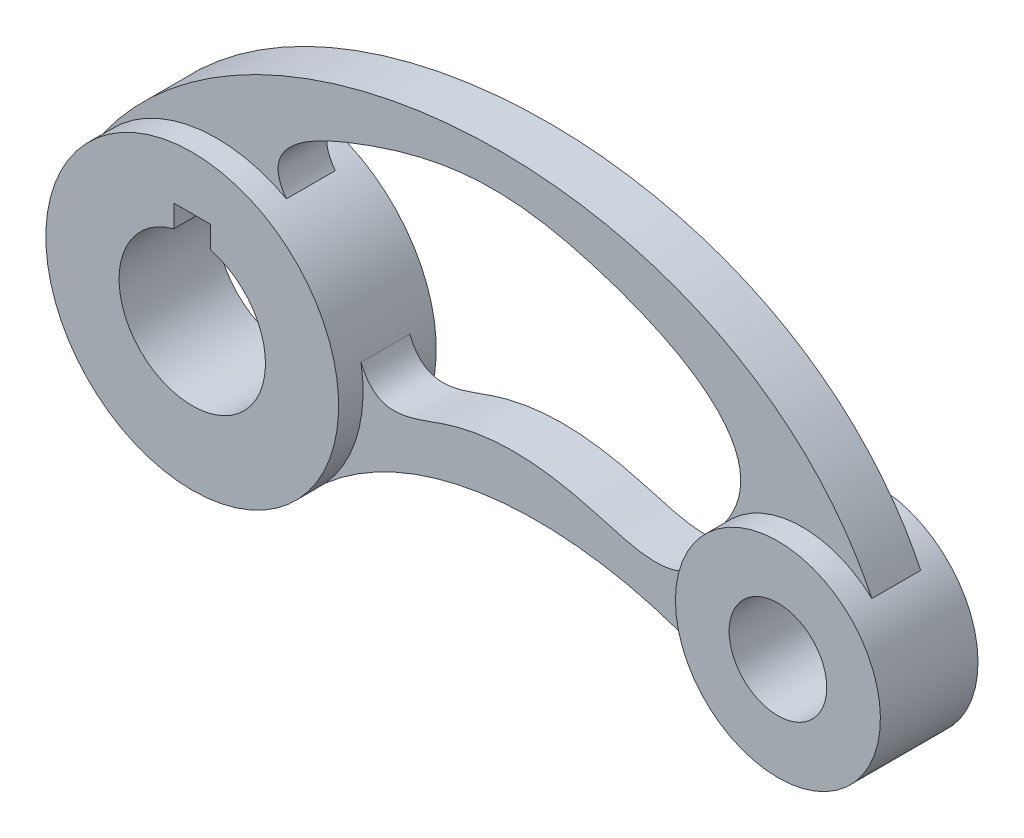
ISO-10303-21;
HEADER;
FILE_DESCRIPTION(('STEP AP214'),'2;1');
FILE_NAME('part.step','',(''),(''),'','','');
FILE_SCHEMA(('AUTOMOTIVE_DESIGN { 1 0 10303 214 1 1 1 1 }'));
ENDSEC;
DATA;
#1=APPLICATION_CONTEXT('core data for automotive mechanical design processes');
#2=APPLICATION_PROTOCOL_DEFINITION('international standard','automotive_design',2000,#1);
#3=PRODUCT_CONTEXT('',#1,'mechanical');
#4=PRODUCT('Part','Part','',(#3));
#5=PRODUCT_RELATED_PRODUCT_CATEGORY('part','',(#4));
#6=PRODUCT_DEFINITION_FORMATION('','',#4);
#7=PRODUCT_DEFINITION_CONTEXT('part definition',#1,'design');
#8=PRODUCT_DEFINITION('design','',#6,#7);
#9=PRODUCT_DEFINITION_SHAPE('','',#8);
#10=(LENGTH_UNIT() NAMED_UNIT(*) SI_UNIT(.MILLI.,.METRE.));
#11=(NAMED_UNIT(*) PLANE_ANGLE_UNIT() SI_UNIT($,.RADIAN.));
#12=(NAMED_UNIT(*) SI_UNIT($,.STERADIAN.) SOLID_ANGLE_UNIT());
#13=UNCERTAINTY_MEASURE_WITH_UNIT(LENGTH_MEASURE(1.E-05),#10,'distance_accuracy_value','');
#14=(GEOMETRIC_REPRESENTATION_CONTEXT(3) GLOBAL_UNCERTAINTY_ASSIGNED_CONTEXT((#13)) GLOBAL_UNIT_ASSIGNED_CONTEXT((#10,
#11,#12)) REPRESENTATION_CONTEXT('',''));
#15=CARTESIAN_POINT('',(0.,0.,0.));
#16=DIRECTION('',(0.,0.,1.));
#17=DIRECTION('',(1.,0.,0.));
#18=AXIS2_PLACEMENT_3D('',#15,#16,#17);
#19=CARTESIAN_POINT('',(-91.6861836239554,0.192134417452549,-10.));
#20=DIRECTION('',(0.,0.,1.));
#21=DIRECTION('',(1.,0.,0.));
#22=AXIS2_PLACEMENT_3D('',#19,#20,#21);
#23=CYLINDRICAL_SURFACE('',#22,30.);
#24=DIRECTION('',(0.,0.,1.));
#25=VECTOR('',#24,1.);
#26=CARTESIAN_POINT('',(-117.149088001357,16.0553150779416,-10.));
#27=LINE('',#26,#25);
#28=CARTESIAN_POINT('',(-117.149088001357,16.0553150779416,-10.));
#29=VERTEX_POINT('',#28);
#30=CARTESIAN_POINT('',(-117.149088001357,16.0553150779416,-5.));
#31=VERTEX_POINT('',#30);
#32=EDGE_CURVE('E338',#29,#31,#27,.T.);
#33=ORIENTED_EDGE('',*,*,#32,.T.);
#34=CARTESIAN_POINT('',(-91.6861836239554,0.192134417452549,-5.));
#35=DIRECTION('',(0.,0.,1.));
#36=DIRECTION('',(1.,0.,0.));
#37=AXIS2_PLACEMENT_3D('',#34,#35,#36);
#38=CIRCLE('',#37,30.);
#39=CARTESIAN_POINT('',(-77.3865652534526,26.5648649256495,-5.));
#40=VERTEX_POINT('',#39);
#41=EDGE_CURVE('E254',#40,#31,#38,.T.);
#42=ORIENTED_EDGE('',*,*,#41,.F.);
#43=DIRECTION('',(0.,0.,1.));
#44=VECTOR('',#43,1.);
#45=CARTESIAN_POINT('',(-77.3865652534526,26.5648649256495,-5.));
#46=LINE('',#45,#44);
#47=CARTESIAN_POINT('',(-77.3865652534526,26.5648649256495,5.));
#48=VERTEX_POINT('',#47);
#49=EDGE_CURVE('E266',#40,#48,#46,.T.);
#50=ORIENTED_EDGE('',*,*,#49,.T.);
#51=CARTESIAN_POINT('',(-91.6861836239554,0.192134417452549,5.));
#52=DIRECTION('',(0.,0.,1.));
#53=DIRECTION('',(1.,0.,0.));
#54=AXIS2_PLACEMENT_3D('',#51,#52,#53);
#55=CIRCLE('',#54,30.);
#56=CARTESIAN_POINT('',(-117.149088001357,16.0553150779416,5.));
#57=VERTEX_POINT('',#56);
#58=EDGE_CURVE('E524',#48,#57,#55,.T.);
#59=ORIENTED_EDGE('',*,*,#58,.T.);
#60=CARTESIAN_POINT('',(-117.149088001357,16.0553150779416,10.));
#61=VERTEX_POINT('',#60);
#62=EDGE_CURVE('E340',#57,#61,#27,.T.);
#63=ORIENTED_EDGE('',*,*,#62,.T.);
#64=CARTESIAN_POINT('',(-91.6861836239554,0.192134417452549,10.));
#65=DIRECTION('',(0.,0.,1.));
#66=DIRECTION('',(1.,0.,0.));
#67=AXIS2_PLACEMENT_3D('',#64,#65,#66);
#68=CIRCLE('',#67,30.);
#69=CARTESIAN_POINT('',(-117.209659143342,15.9576727023089,10.));
#70=VERTEX_POINT('',#69);
#71=EDGE_CURVE('E282',#70,#61,#68,.T.);
#72=ORIENTED_EDGE('',*,*,#71,.F.);
#73=DIRECTION('',(0.,0.,1.));
#74=VECTOR('',#73,1.);
#75=CARTESIAN_POINT('',(-117.209659143342,15.9576727023089,-10.));
#76=LINE('',#75,#74);
#77=CARTESIAN_POINT('',(-117.209659143342,15.9576727023089,-10.));
#78=VERTEX_POINT('',#77);
#79=EDGE_CURVE('E52',#78,#70,#76,.T.);
#80=ORIENTED_EDGE('',*,*,#79,.F.);
#81=CARTESIAN_POINT('',(-91.6861836239554,0.192134417452549,-10.));
#82=DIRECTION('',(0.,0.,1.));
#83=DIRECTION('',(1.,0.,0.));
#84=AXIS2_PLACEMENT_3D('',#81,#82,#83);
#85=CIRCLE('',#84,30.);
#86=EDGE_CURVE('E310',#78,#29,#85,.T.);
#87=ORIENTED_EDGE('',*,*,#86,.T.);
#88=EDGE_LOOP('',(#33,#42,#50,#59,#63,#72,#80,#87));
#89=FACE_BOUND('',#88,.T.);
#90=DIRECTION('',(0.,0.,1.));
#91=VECTOR('',#90,1.);
#92=CARTESIAN_POINT('',(-62.1049143779897,5.18698274324613,-5.));
#93=LINE('',#92,#91);
#94=CARTESIAN_POINT('',(-62.1049143779896,5.18698274324613,-5.));
#95=VERTEX_POINT('',#94);
#96=CARTESIAN_POINT('',(-62.1049143779897,5.18698274324613,5.));
#97=VERTEX_POINT('',#96);
#98=EDGE_CURVE('E66',#95,#97,#93,.T.);
#99=ORIENTED_EDGE('',*,*,#98,.F.);
#100=CARTESIAN_POINT('',(-91.6861836239554,0.192134417452549,-5.));
#101=DIRECTION('',(0.,0.,1.));
#102=DIRECTION('',(1.,0.,0.));
#103=AXIS2_PLACEMENT_3D('',#100,#101,#102);
#104=CIRCLE('',#103,30.);
#105=CARTESIAN_POINT('',(-69.3616146887647,-19.8481655268577,-5.));
#106=VERTEX_POINT('',#105);
#107=EDGE_CURVE('E70',#106,#95,#104,.T.);
#108=ORIENTED_EDGE('',*,*,#107,.F.);
#109=DIRECTION('',(0.,0.,1.));
#110=VECTOR('',#109,1.);
#111=CARTESIAN_POINT('',(-69.3616146887647,-19.8481655268577,-5.));
#112=LINE('',#111,#110);
#113=CARTESIAN_POINT('',(-69.3616146887647,-19.8481655268577,5.));
#114=VERTEX_POINT('',#113);
#115=EDGE_CURVE('E158',#106,#114,#112,.T.);
#116=ORIENTED_EDGE('',*,*,#115,.T.);
#117=CARTESIAN_POINT('',(-91.6861836239554,0.192134417452549,5.));
#118=DIRECTION('',(0.,0.,1.));
#119=DIRECTION('',(1.,0.,0.));
#120=AXIS2_PLACEMENT_3D('',#117,#118,#119);
#121=CIRCLE('',#120,30.);
#122=EDGE_CURVE('E161',#114,#97,#121,.T.);
#123=ORIENTED_EDGE('',*,*,#122,.T.);
#124=EDGE_LOOP('',(#99,#108,#116,#123));
#125=FACE_BOUND('',#124,.T.);
#126=ADVANCED_FACE('F47',(#89,#125),#23,.T.);
#127=CARTESIAN_POINT('',(28.3138163760446,0.192134417452549,-10.));
#128=DIRECTION('',(0.,0.,1.));
#129=DIRECTION('',(1.,0.,0.));
#130=AXIS2_PLACEMENT_3D('',#127,#128,#129);
#131=CYLINDRICAL_SURFACE('',#130,21.);
#132=CARTESIAN_POINT('',(28.3138163760446,0.192134417452549,-5.));
#133=DIRECTION('',(0.,0.,1.));
#134=DIRECTION('',(1.,0.,0.));
#135=AXIS2_PLACEMENT_3D('',#132,#133,#134);
#136=CIRCLE('',#135,21.);
#137=CARTESIAN_POINT('',(42.5666227122662,15.6147642691401,-5.));
#138=VERTEX_POINT('',#137);
#139=CARTESIAN_POINT('',(12.1963912193826,13.6542518704908,-5.));
#140=VERTEX_POINT('',#139);
#141=EDGE_CURVE('E253',#138,#140,#136,.T.);
#142=ORIENTED_EDGE('',*,*,#141,.F.);
#143=DIRECTION('',(0.,0.,1.));
#144=VECTOR('',#143,1.);
#145=CARTESIAN_POINT('',(42.5666227122662,15.6147642691401,-5.));
#146=LINE('',#145,#144);
#147=CARTESIAN_POINT('',(42.5666227122662,15.6147642691401,5.));
#148=VERTEX_POINT('',#147);
#149=EDGE_CURVE('E267',#138,#148,#146,.T.);
#150=ORIENTED_EDGE('',*,*,#149,.T.);
#151=CARTESIAN_POINT('',(28.3138163760446,0.192134417452549,5.));
#152=DIRECTION('',(0.,0.,1.));
#153=DIRECTION('',(1.,0.,0.));
#154=AXIS2_PLACEMENT_3D('',#151,#152,#153);
#155=CIRCLE('',#154,21.);
#156=CARTESIAN_POINT('',(12.1963912193826,13.6542518704908,5.));
#157=VERTEX_POINT('',#156);
#158=EDGE_CURVE('E536',#148,#157,#155,.T.);
#159=ORIENTED_EDGE('',*,*,#158,.T.);
#160=DIRECTION('',(0.,0.,1.));
#161=VECTOR('',#160,1.);
#162=CARTESIAN_POINT('',(12.1963912193826,13.6542518704908,-10.));
#163=LINE('',#162,#161);
#164=CARTESIAN_POINT('',(12.1963912193826,13.6542518704908,10.));
#165=VERTEX_POINT('',#164);
#166=EDGE_CURVE('E517',#157,#165,#163,.T.);
#167=ORIENTED_EDGE('',*,*,#166,.T.);
#168=CARTESIAN_POINT('',(28.3138163760446,0.192134417452549,10.));
#169=DIRECTION('',(0.,0.,1.));
#170=DIRECTION('',(1.,0.,0.));
#171=AXIS2_PLACEMENT_3D('',#168,#169,#170);
#172=CIRCLE('',#171,21.);
#173=CARTESIAN_POINT('',(11.1123390152125,12.2382614550019,10.));
#174=VERTEX_POINT('',#173);
#175=EDGE_CURVE('E484',#174,#165,#172,.T.);
#176=ORIENTED_EDGE('',*,*,#175,.F.);
#177=DIRECTION('',(0.,0.,1.));
#178=VECTOR('',#177,1.);
#179=CARTESIAN_POINT('',(11.1123390152125,12.2382614550019,-10.));
#180=LINE('',#179,#178);
#181=CARTESIAN_POINT('',(11.1123390152125,12.2382614550019,-10.));
#182=VERTEX_POINT('',#181);
#183=EDGE_CURVE('E518',#182,#174,#180,.T.);
#184=ORIENTED_EDGE('',*,*,#183,.F.);
#185=CARTESIAN_POINT('',(28.3138163760446,0.192134417452549,-10.));
#186=DIRECTION('',(0.,0.,1.));
#187=DIRECTION('',(1.,0.,0.));
#188=AXIS2_PLACEMENT_3D('',#185,#186,#187);
#189=CIRCLE('',#188,21.);
#190=CARTESIAN_POINT('',(12.1963912193826,13.6542518704908,-10.));
#191=VERTEX_POINT('',#190);
#192=EDGE_CURVE('E507',#182,#191,#189,.T.);
#193=ORIENTED_EDGE('',*,*,#192,.T.);
#194=EDGE_CURVE('E525',#191,#140,#163,.T.);
#195=ORIENTED_EDGE('',*,*,#194,.T.);
#196=EDGE_LOOP('',(#142,#150,#159,#167,#176,#184,#193,#195));
#197=FACE_BOUND('',#196,.T.);
#198=DIRECTION('',(0.,0.,1.));
#199=VECTOR('',#198,1.);
#200=CARTESIAN_POINT('',(13.0490035363857,-14.2295675961859,-5.));
#201=LINE('',#200,#199);
#202=CARTESIAN_POINT('',(13.0490035363857,-14.2295675961859,-5.));
#203=VERTEX_POINT('',#202);
#204=CARTESIAN_POINT('',(13.0490035363857,-14.2295675961859,5.));
#205=VERTEX_POINT('',#204);
#206=EDGE_CURVE('E166',#203,#205,#201,.T.);
#207=ORIENTED_EDGE('',*,*,#206,.F.);
#208=CARTESIAN_POINT('',(28.3138163760446,0.192134417452549,-5.));
#209=DIRECTION('',(0.,0.,1.));
#210=DIRECTION('',(1.,0.,0.));
#211=AXIS2_PLACEMENT_3D('',#208,#209,#210);
#212=CIRCLE('',#211,21.);
#213=CARTESIAN_POINT('',(7.66747778521394,4.02993362960206,-5.));
#214=VERTEX_POINT('',#213);
#215=EDGE_CURVE('E475',#214,#203,#212,.T.);
#216=ORIENTED_EDGE('',*,*,#215,.F.);
#217=DIRECTION('',(0.,0.,1.));
#218=VECTOR('',#217,1.);
#219=CARTESIAN_POINT('',(7.66747778521396,4.02993362960205,-5.));
#220=LINE('',#219,#218);
#221=CARTESIAN_POINT('',(7.66747778521396,4.02993362960205,5.));
#222=VERTEX_POINT('',#221);
#223=EDGE_CURVE('E476',#214,#222,#220,.T.);
#224=ORIENTED_EDGE('',*,*,#223,.T.);
#225=CARTESIAN_POINT('',(28.3138163760446,0.192134417452549,5.));
#226=DIRECTION('',(0.,0.,1.));
#227=DIRECTION('',(1.,0.,0.));
#228=AXIS2_PLACEMENT_3D('',#225,#226,#227);
#229=CIRCLE('',#228,21.);
#230=EDGE_CURVE('E175',#222,#205,#229,.T.);
#231=ORIENTED_EDGE('',*,*,#230,.T.);
#232=EDGE_LOOP('',(#207,#216,#224,#231));
#233=FACE_BOUND('',#232,.T.);
#234=ADVANCED_FACE('F222',(#197,#233),#131,.T.);
#235=CARTESIAN_POINT('',(-91.6861836239554,0.192134417452549,-10.));
#236=DIRECTION('',(0.,0.,1.));
#237=DIRECTION('',(1.,0.,0.));
#238=AXIS2_PLACEMENT_3D('',#235,#236,#237);
#239=CYLINDRICAL_SURFACE('',#238,15.);
#240=DIRECTION('',(0.,0.,1.));
#241=VECTOR('',#240,1.);
#242=CARTESIAN_POINT('',(-95.4725947076119,14.7063719484275,-10.));
#243=LINE('',#242,#241);
#244=CARTESIAN_POINT('',(-95.4725947076119,14.7063719484275,-10.));
#245=VERTEX_POINT('',#244);
#246=CARTESIAN_POINT('',(-95.4725947076119,14.7063719484275,10.));
#247=VERTEX_POINT('',#246);
#248=EDGE_CURVE('E336',#245,#247,#243,.T.);
#249=ORIENTED_EDGE('',*,*,#248,.T.);
#250=CARTESIAN_POINT('',(-91.6861836239554,0.192134417452549,10.));
#251=DIRECTION('',(0.,0.,1.));
#252=DIRECTION('',(1.,0.,0.));
#253=AXIS2_PLACEMENT_3D('',#250,#251,#252);
#254=CIRCLE('',#253,15.);
#255=CARTESIAN_POINT('',(-87.8997725402989,14.7063719484275,10.));
#256=VERTEX_POINT('',#255);
#257=EDGE_CURVE('E289',#247,#256,#254,.T.);
#258=ORIENTED_EDGE('',*,*,#257,.T.);
#259=DIRECTION('',(0.,0.,1.));
#260=VECTOR('',#259,1.);
#261=CARTESIAN_POINT('',(-87.8997725402989,14.7063719484275,-10.));
#262=LINE('',#261,#260);
#263=CARTESIAN_POINT('',(-87.8997725402989,14.7063719484275,-10.));
#264=VERTEX_POINT('',#263);
#265=EDGE_CURVE('E11',#264,#256,#262,.T.);
#266=ORIENTED_EDGE('',*,*,#265,.F.);
#267=CARTESIAN_POINT('',(-91.6861836239554,0.192134417452549,-10.));
#268=DIRECTION('',(0.,0.,1.));
#269=DIRECTION('',(1.,0.,0.));
#270=AXIS2_PLACEMENT_3D('',#267,#268,#269);
#271=CIRCLE('',#270,15.);
#272=EDGE_CURVE('E317',#245,#264,#271,.T.);
#273=ORIENTED_EDGE('',*,*,#272,.F.);
#274=EDGE_LOOP('',(#249,#258,#266,#273));
#275=FACE_BOUND('',#274,.T.);
#276=ADVANCED_FACE('F225',(#275),#239,.F.);
#277=CARTESIAN_POINT('',(-87.8997725403002,8.27533506242133E-12,-10.));
#278=DIRECTION('',(1.,0.,0.));
#279=DIRECTION('',(0.,1.,0.));
#280=AXIS2_PLACEMENT_3D('',#277,#278,#279);
#281=PLANE('',#280);
#282=ORIENTED_EDGE('',*,*,#265,.T.);
#283=DIRECTION('',(0.,1.,0.));
#284=VECTOR('',#283,1.);
#285=CARTESIAN_POINT('',(-87.8997725403002,8.27533506242133E-12,10.));
#286=LINE('',#285,#284);
#287=CARTESIAN_POINT('',(-87.8997725402984,19.2760341864527,10.));
#288=VERTEX_POINT('',#287);
#289=EDGE_CURVE('E301',#256,#288,#286,.T.);
#290=ORIENTED_EDGE('',*,*,#289,.T.);
#291=DIRECTION('',(0.,0.,1.));
#292=VECTOR('',#291,1.);
#293=CARTESIAN_POINT('',(-87.8997725402984,19.2760341864527,-10.));
#294=LINE('',#293,#292);
#295=CARTESIAN_POINT('',(-87.8997725402984,19.2760341864527,-10.));
#296=VERTEX_POINT('',#295);
#297=EDGE_CURVE('E58',#296,#288,#294,.T.);
#298=ORIENTED_EDGE('',*,*,#297,.F.);
#299=DIRECTION('',(0.,1.,0.));
#300=VECTOR('',#299,1.);
#301=CARTESIAN_POINT('',(-87.8997725403002,8.27533506242133E-12,-10.));
#302=LINE('',#301,#300);
#303=EDGE_CURVE('E328',#264,#296,#302,.T.);
#304=ORIENTED_EDGE('',*,*,#303,.F.);
#305=EDGE_LOOP('',(#282,#290,#298,#304));
#306=FACE_BOUND('',#305,.T.);
#307=ADVANCED_FACE('F372',(#306),#281,.F.);
#308=CARTESIAN_POINT('',(2.11949024793215E-13,19.2760341864518,-10.));
#309=DIRECTION('',(0.,1.,0.));
#310=DIRECTION('',(-1.,0.,0.));
#311=AXIS2_PLACEMENT_3D('',#308,#309,#310);
#312=PLANE('',#311);
#313=ORIENTED_EDGE('',*,*,#297,.T.);
#314=DIRECTION('',(-1.,0.,0.));
#315=VECTOR('',#314,1.);
#316=CARTESIAN_POINT('',(2.11949024793215E-13,19.2760341864518,10.));
#317=LINE('',#316,#315);
#318=CARTESIAN_POINT('',(-95.4725947076119,19.2760341864528,10.));
#319=VERTEX_POINT('',#318);
#320=EDGE_CURVE('E297',#288,#319,#317,.T.);
#321=ORIENTED_EDGE('',*,*,#320,.T.);
#322=DIRECTION('',(0.,0.,1.));
#323=VECTOR('',#322,1.);
#324=CARTESIAN_POINT('',(-95.4725947076119,19.2760341864528,-10.));
#325=LINE('',#324,#323);
#326=CARTESIAN_POINT('',(-95.4725947076119,19.2760341864528,-10.));
#327=VERTEX_POINT('',#326);
#328=EDGE_CURVE('E333',#327,#319,#325,.T.);
#329=ORIENTED_EDGE('',*,*,#328,.F.);
#330=DIRECTION('',(-1.,0.,0.));
#331=VECTOR('',#330,1.);
#332=CARTESIAN_POINT('',(2.11949024793215E-13,19.2760341864518,-10.));
#333=LINE('',#332,#331);
#334=EDGE_CURVE('E325',#296,#327,#333,.T.);
#335=ORIENTED_EDGE('',*,*,#334,.F.);
#336=EDGE_LOOP('',(#313,#321,#329,#335));
#337=FACE_BOUND('',#336,.T.);
#338=ADVANCED_FACE('F369',(#337),#312,.F.);
#339=CARTESIAN_POINT('',(-117.209659143342,15.9576727023089,-10.));
#340=CARTESIAN_POINT('',(-84.6753540802233,68.5009184786909,-10.));
#341=CARTESIAN_POINT('',(15.0574098943898,72.7650791319882,-10.));
#342=CARTESIAN_POINT('',(42.5666227122662,15.6147642691401,-10.));
#343=B_SPLINE_CURVE_WITH_KNOTS('',3,(#339,#340,#341,#342),.UNSPECIFIED.,.F.,.F.,(4,4),(0.,1.),.UNSPECIFIED.);
#344=DIRECTION('',(0.,0.,1.));
#345=VECTOR('',#344,1.);
#346=SURFACE_OF_LINEAR_EXTRUSION('',#343,#345);
#347=ORIENTED_EDGE('',*,*,#79,.T.);
#348=CARTESIAN_POINT('',(-117.209659143342,15.9576727023089,10.));
#349=CARTESIAN_POINT('',(-84.6753540802233,68.5009184786909,10.));
#350=CARTESIAN_POINT('',(15.0574098943898,72.7650791319882,10.));
#351=CARTESIAN_POINT('',(42.5666227122662,15.6147642691401,10.));
#352=B_SPLINE_CURVE_WITH_KNOTS('',3,(#348,#349,#350,#351),.UNSPECIFIED.,.F.,.F.,(4,4),(0.,1.),.UNSPECIFIED.);
#353=EDGE_CURVE('E274',#70,#61,#352,.T.);
#354=ORIENTED_EDGE('',*,*,#353,.T.);
#355=ORIENTED_EDGE('',*,*,#62,.F.);
#356=CARTESIAN_POINT('',(-117.209659143342,15.9576727023089,5.));
#357=CARTESIAN_POINT('',(-84.6753540802233,68.5009184786909,5.));
#358=CARTESIAN_POINT('',(15.0574098943898,72.7650791319882,5.));
#359=CARTESIAN_POINT('',(42.5666227122662,15.6147642691401,5.));
#360=B_SPLINE_CURVE_WITH_KNOTS('',3,(#356,#357,#358,#359),.UNSPECIFIED.,.F.,.F.,(4,4),(0.,1.),.UNSPECIFIED.);
#361=EDGE_CURVE('E542',#57,#148,#360,.T.);
#362=ORIENTED_EDGE('',*,*,#361,.T.);
#363=ORIENTED_EDGE('',*,*,#149,.F.);
#364=CARTESIAN_POINT('',(-117.209659143342,15.9576727023089,-5.));
#365=CARTESIAN_POINT('',(-84.6753540802233,68.5009184786909,-5.));
#366=CARTESIAN_POINT('',(15.0574098943898,72.7650791319882,-5.));
#367=CARTESIAN_POINT('',(42.5666227122662,15.6147642691401,-5.));
#368=B_SPLINE_CURVE_WITH_KNOTS('',3,(#364,#365,#366,#367),.UNSPECIFIED.,.F.,.F.,(4,4),(0.,1.),.UNSPECIFIED.);
#369=EDGE_CURVE('E261',#31,#138,#368,.T.);
#370=ORIENTED_EDGE('',*,*,#369,.F.);
#371=ORIENTED_EDGE('',*,*,#32,.F.);
#372=EDGE_CURVE('E304',#78,#29,#343,.T.);
#373=ORIENTED_EDGE('',*,*,#372,.F.);
#374=EDGE_LOOP('',(#347,#354,#355,#362,#363,#370,#371,#373));
#375=FACE_BOUND('',#374,.T.);
#376=ADVANCED_FACE('F49',(#375),#346,.F.);
#377=CARTESIAN_POINT('',(-95.4725947076119,0.,-10.));
#378=DIRECTION('',(1.,0.,0.));
#379=DIRECTION('',(0.,0.,-1.));
#380=AXIS2_PLACEMENT_3D('',#377,#378,#379);
#381=PLANE('',#380);
#382=ORIENTED_EDGE('',*,*,#328,.T.);
#383=DIRECTION('',(0.,1.,0.));
#384=VECTOR('',#383,1.);
#385=CARTESIAN_POINT('',(-95.4725947076119,0.,10.));
#386=LINE('',#385,#384);
#387=EDGE_CURVE('E293',#247,#319,#386,.T.);
#388=ORIENTED_EDGE('',*,*,#387,.F.);
#389=ORIENTED_EDGE('',*,*,#248,.F.);
#390=DIRECTION('',(0.,1.,0.));
#391=VECTOR('',#390,1.);
#392=CARTESIAN_POINT('',(-95.4725947076119,0.,-10.));
#393=LINE('',#392,#391);
#394=EDGE_CURVE('E321',#245,#327,#393,.T.);
#395=ORIENTED_EDGE('',*,*,#394,.T.);
#396=EDGE_LOOP('',(#382,#388,#389,#395));
#397=FACE_BOUND('',#396,.T.);
#398=ADVANCED_FACE('F365',(#397),#381,.T.);
#399=CARTESIAN_POINT('',(0.,0.,-10.));
#400=DIRECTION('',(0.,0.,1.));
#401=DIRECTION('',(1.,0.,0.));
#402=AXIS2_PLACEMENT_3D('',#399,#400,#401);
#403=PLANE('',#402);
#404=ORIENTED_EDGE('',*,*,#372,.T.);
#405=ORIENTED_EDGE('',*,*,#86,.F.);
#406=EDGE_LOOP('',(#404,#405));
#407=FACE_BOUND('',#406,.T.);
#408=ORIENTED_EDGE('',*,*,#272,.T.);
#409=ORIENTED_EDGE('',*,*,#303,.T.);
#410=ORIENTED_EDGE('',*,*,#334,.T.);
#411=ORIENTED_EDGE('',*,*,#394,.F.);
#412=EDGE_LOOP('',(#408,#409,#410,#411));
#413=FACE_BOUND('',#412,.T.);
#414=ADVANCED_FACE('F355',(#407,#413),#403,.F.);
#415=CARTESIAN_POINT('',(0.,0.,10.));
#416=DIRECTION('',(0.,0.,1.));
#417=DIRECTION('',(1.,0.,0.));
#418=AXIS2_PLACEMENT_3D('',#415,#416,#417);
#419=PLANE('',#418);
#420=ORIENTED_EDGE('',*,*,#353,.F.);
#421=ORIENTED_EDGE('',*,*,#71,.T.);
#422=EDGE_LOOP('',(#420,#421));
#423=FACE_BOUND('',#422,.T.);
#424=ORIENTED_EDGE('',*,*,#257,.F.);
#425=ORIENTED_EDGE('',*,*,#387,.T.);
#426=ORIENTED_EDGE('',*,*,#320,.F.);
#427=ORIENTED_EDGE('',*,*,#289,.F.);
#428=EDGE_LOOP('',(#424,#425,#426,#427));
#429=FACE_BOUND('',#428,.T.);
#430=ADVANCED_FACE('F242',(#423,#429),#419,.T.);
#431=CARTESIAN_POINT('',(-77.3865652534526,26.5648649256495,-5.));
#432=CARTESIAN_POINT('',(-83.4322886508997,34.6649954367082,-5.));
#433=CARTESIAN_POINT('',(-50.6284209790579,50.5651746260133,-5.));
#434=CARTESIAN_POINT('',(-17.6554774637431,51.5644019503931,-5.));
#435=CARTESIAN_POINT('',(25.2467260595945,29.6095375838261,-5.));
#436=CARTESIAN_POINT('',(11.1123390152125,12.2382614550019,-5.));
#437=B_SPLINE_CURVE_WITH_KNOTS('',3,(#431,#432,#433,#434,#435,#436),.UNSPECIFIED.,.F.,.F.,(4,1,
1,4),(0.,0.204044151175208,0.600639192574909,1.),.UNSPECIFIED.);
#438=DIRECTION('',(0.,0.,1.));
#439=VECTOR('',#438,1.);
#440=SURFACE_OF_LINEAR_EXTRUSION('',#437,#439);
#441=EDGE_CURVE('E245',#40,#140,#437,.T.);
#442=ORIENTED_EDGE('',*,*,#441,.T.);
#443=ORIENTED_EDGE('',*,*,#194,.F.);
#444=CARTESIAN_POINT('',(-77.3865652534526,26.5648649256495,-10.));
#445=CARTESIAN_POINT('',(-83.4322886508997,34.6649954367082,-10.));
#446=CARTESIAN_POINT('',(-50.6284209790579,50.5651746260133,-10.));
#447=CARTESIAN_POINT('',(-17.6554774637431,51.5644019503931,-10.));
#448=CARTESIAN_POINT('',(25.2467260595945,29.6095375838261,-10.));
#449=CARTESIAN_POINT('',(11.1123390152125,12.2382614550019,-10.));
#450=B_SPLINE_CURVE_WITH_KNOTS('',3,(#444,#445,#446,#447,#448,#449),.UNSPECIFIED.,.F.,.F.,(4,1,
1,4),(0.,0.204044151175208,0.600639192574909,1.),.UNSPECIFIED.);
#451=EDGE_CURVE('E511',#191,#182,#450,.T.);
#452=ORIENTED_EDGE('',*,*,#451,.T.);
#453=ORIENTED_EDGE('',*,*,#183,.T.);
#454=CARTESIAN_POINT('',(-77.3865652534526,26.5648649256495,10.));
#455=CARTESIAN_POINT('',(-83.4322886508997,34.6649954367082,10.));
#456=CARTESIAN_POINT('',(-50.6284209790579,50.5651746260133,10.));
#457=CARTESIAN_POINT('',(-17.6554774637431,51.5644019503931,10.));
#458=CARTESIAN_POINT('',(25.2467260595945,29.6095375838261,10.));
#459=CARTESIAN_POINT('',(11.1123390152125,12.2382614550019,10.));
#460=B_SPLINE_CURVE_WITH_KNOTS('',3,(#454,#455,#456,#457,#458,#459),.UNSPECIFIED.,.F.,.F.,(4,1,
1,4),(0.,0.204044151175208,0.600639192574909,1.),.UNSPECIFIED.);
#461=EDGE_CURVE('E494',#165,#174,#460,.T.);
#462=ORIENTED_EDGE('',*,*,#461,.F.);
#463=ORIENTED_EDGE('',*,*,#166,.F.);
#464=CARTESIAN_POINT('',(-77.3865652534526,26.5648649256495,5.));
#465=CARTESIAN_POINT('',(-83.4322886508997,34.6649954367082,5.));
#466=CARTESIAN_POINT('',(-50.6284209790579,50.5651746260133,5.));
#467=CARTESIAN_POINT('',(-17.6554774637431,51.5644019503931,5.));
#468=CARTESIAN_POINT('',(25.2467260595945,29.6095375838261,5.));
#469=CARTESIAN_POINT('',(11.1123390152125,12.2382614550019,5.));
#470=B_SPLINE_CURVE_WITH_KNOTS('',3,(#464,#465,#466,#467,#468,#469),.UNSPECIFIED.,.F.,.F.,(4,1,
1,4),(0.,0.204044151175208,0.600639192574909,1.),.UNSPECIFIED.);
#471=EDGE_CURVE('E531',#48,#157,#470,.T.);
#472=ORIENTED_EDGE('',*,*,#471,.F.);
#473=ORIENTED_EDGE('',*,*,#49,.F.);
#474=EDGE_LOOP('',(#442,#443,#452,#453,#462,#463,#472,#473));
#475=FACE_BOUND('',#474,.T.);
#476=ADVANCED_FACE('F237',(#475),#440,.T.);
#477=CARTESIAN_POINT('',(0.,0.,-5.));
#478=DIRECTION('',(0.,0.,1.));
#479=DIRECTION('',(1.,0.,0.));
#480=AXIS2_PLACEMENT_3D('',#477,#478,#479);
#481=PLANE('',#480);
#482=ORIENTED_EDGE('',*,*,#41,.T.);
#483=ORIENTED_EDGE('',*,*,#369,.T.);
#484=ORIENTED_EDGE('',*,*,#141,.T.);
#485=ORIENTED_EDGE('',*,*,#441,.F.);
#486=EDGE_LOOP('',(#482,#483,#484,#485));
#487=FACE_BOUND('',#486,.T.);
#488=ADVANCED_FACE('F233',(#487),#481,.F.);
#489=CARTESIAN_POINT('',(0.,0.,5.));
#490=DIRECTION('',(0.,0.,1.));
#491=DIRECTION('',(1.,0.,0.));
#492=AXIS2_PLACEMENT_3D('',#489,#490,#491);
#493=PLANE('',#492);
#494=ORIENTED_EDGE('',*,*,#58,.F.);
#495=ORIENTED_EDGE('',*,*,#471,.T.);
#496=ORIENTED_EDGE('',*,*,#158,.F.);
#497=ORIENTED_EDGE('',*,*,#361,.F.);
#498=EDGE_LOOP('',(#494,#495,#496,#497));
#499=FACE_BOUND('',#498,.T.);
#500=ADVANCED_FACE('F229',(#499),#493,.T.);
#501=CARTESIAN_POINT('',(28.3138163760446,0.192134417452549,-10.));
#502=DIRECTION('',(0.,0.,1.));
#503=DIRECTION('',(1.,0.,0.));
#504=AXIS2_PLACEMENT_3D('',#501,#502,#503);
#505=CYLINDRICAL_SURFACE('',#504,10.);
#506=CARTESIAN_POINT('',(28.3138163760446,0.192134417452549,-10.));
#507=DIRECTION('',(0.,0.,1.));
#508=DIRECTION('',(1.,0.,0.));
#509=AXIS2_PLACEMENT_3D('',#506,#507,#508);
#510=CIRCLE('',#509,10.);
#511=CARTESIAN_POINT('',(38.3138163760446,0.192134417452549,-10.));
#512=VERTEX_POINT('',#511);
#513=EDGE_CURVE('E500',#512,#512,#510,.T.);
#514=ORIENTED_EDGE('',*,*,#513,.F.);
#515=EDGE_LOOP('',(#514));
#516=FACE_BOUND('',#515,.T.);
#517=CARTESIAN_POINT('',(28.3138163760446,0.192134417452549,10.));
#518=DIRECTION('',(0.,0.,1.));
#519=DIRECTION('',(1.,0.,0.));
#520=AXIS2_PLACEMENT_3D('',#517,#518,#519);
#521=CIRCLE('',#520,10.);
#522=CARTESIAN_POINT('',(38.3138163760446,0.192134417452549,10.));
#523=VERTEX_POINT('',#522);
#524=EDGE_CURVE('E479',#523,#523,#521,.T.);
#525=ORIENTED_EDGE('',*,*,#524,.T.);
#526=EDGE_LOOP('',(#525));
#527=FACE_BOUND('',#526,.T.);
#528=ADVANCED_FACE('F220',(#516,#527),#505,.F.);
#529=CARTESIAN_POINT('',(0.,0.,-10.));
#530=DIRECTION('',(0.,0.,1.));
#531=DIRECTION('',(1.,0.,0.));
#532=AXIS2_PLACEMENT_3D('',#529,#530,#531);
#533=PLANE('',#532);
#534=ORIENTED_EDGE('',*,*,#513,.T.);
#535=EDGE_LOOP('',(#534));
#536=FACE_BOUND('',#535,.T.);
#537=ORIENTED_EDGE('',*,*,#192,.F.);
#538=ORIENTED_EDGE('',*,*,#451,.F.);
#539=EDGE_LOOP('',(#537,#538));
#540=FACE_BOUND('',#539,.T.);
#541=ADVANCED_FACE('F216',(#536,#540),#533,.F.);
#542=CARTESIAN_POINT('',(0.,0.,10.));
#543=DIRECTION('',(0.,0.,1.));
#544=DIRECTION('',(1.,0.,0.));
#545=AXIS2_PLACEMENT_3D('',#542,#543,#544);
#546=PLANE('',#545);
#547=ORIENTED_EDGE('',*,*,#524,.F.);
#548=EDGE_LOOP('',(#547));
#549=FACE_BOUND('',#548,.T.);
#550=ORIENTED_EDGE('',*,*,#175,.T.);
#551=ORIENTED_EDGE('',*,*,#461,.T.);
#552=EDGE_LOOP('',(#550,#551));
#553=FACE_BOUND('',#552,.T.);
#554=ADVANCED_FACE('F211',(#549,#553),#546,.T.);
#555=CARTESIAN_POINT('',(-62.1049143779896,5.18698274324613,-5.));
#556=CARTESIAN_POINT('',(-58.6015162644532,-3.26395573848273,-5.));
#557=CARTESIAN_POINT('',(-40.9157969030878,6.60527496143843,-5.));
#558=CARTESIAN_POINT('',(-17.3641641360027,4.85685920862394,-5.));
#559=CARTESIAN_POINT('',(1.37286124220107,-2.88696063130502,-5.));
#560=CARTESIAN_POINT('',(7.66747778521394,4.02993362960206,-5.));
#561=B_SPLINE_CURVE_WITH_KNOTS('',3,(#555,#556,#557,#558,#559,#560),.UNSPECIFIED.,.F.,.F.,(4,1,
1,4),(0.,0.265783069989413,0.675204605339602,1.),.UNSPECIFIED.);
#562=DIRECTION('',(0.,0.,1.));
#563=VECTOR('',#562,1.);
#564=SURFACE_OF_LINEAR_EXTRUSION('',#561,#563);
#565=ORIENTED_EDGE('',*,*,#98,.T.);
#566=CARTESIAN_POINT('',(-62.1049143779896,5.18698274324613,5.));
#567=CARTESIAN_POINT('',(-58.6015162644532,-3.26395573848273,5.));
#568=CARTESIAN_POINT('',(-40.9157969030878,6.60527496143843,5.));
#569=CARTESIAN_POINT('',(-17.3641641360027,4.85685920862394,5.));
#570=CARTESIAN_POINT('',(1.37286124220107,-2.88696063130502,5.));
#571=CARTESIAN_POINT('',(7.66747778521394,4.02993362960206,5.));
#572=B_SPLINE_CURVE_WITH_KNOTS('',3,(#566,#567,#568,#569,#570,#571),.UNSPECIFIED.,.F.,.F.,(4,1,
1,4),(0.,0.265783069989413,0.675204605339602,1.),.UNSPECIFIED.);
#573=EDGE_CURVE('E180',#97,#222,#572,.T.);
#574=ORIENTED_EDGE('',*,*,#573,.T.);
#575=ORIENTED_EDGE('',*,*,#223,.F.);
#576=EDGE_CURVE('E195',#95,#214,#561,.T.);
#577=ORIENTED_EDGE('',*,*,#576,.F.);
#578=EDGE_LOOP('',(#565,#574,#575,#577));
#579=FACE_BOUND('',#578,.T.);
#580=ADVANCED_FACE('F207',(#579),#564,.F.);
#581=CARTESIAN_POINT('',(-69.3616146887647,-19.8481655268577,-5.));
#582=CARTESIAN_POINT('',(-47.01637263692,-0.448672031425797,-5.));
#583=CARTESIAN_POINT('',(-12.2073572423504,-1.38096461617252,-5.));
#584=CARTESIAN_POINT('',(13.0490035363857,-14.2295675961859,-5.));
#585=B_SPLINE_CURVE_WITH_KNOTS('',3,(#581,#582,#583,#584),.UNSPECIFIED.,.F.,.F.,(4,4),(0.,1.),.UNSPECIFIED.);
#586=DIRECTION('',(0.,0.,1.));
#587=VECTOR('',#586,1.);
#588=SURFACE_OF_LINEAR_EXTRUSION('',#585,#587);
#589=ORIENTED_EDGE('',*,*,#206,.T.);
#590=CARTESIAN_POINT('',(-69.3616146887647,-19.8481655268577,5.));
#591=CARTESIAN_POINT('',(-47.01637263692,-0.448672031425797,5.));
#592=CARTESIAN_POINT('',(-12.2073572423504,-1.38096461617252,5.));
#593=CARTESIAN_POINT('',(13.0490035363857,-14.2295675961859,5.));
#594=B_SPLINE_CURVE_WITH_KNOTS('',3,(#590,#591,#592,#593),.UNSPECIFIED.,.F.,.F.,(4,4),(0.,1.),.UNSPECIFIED.);
#595=EDGE_CURVE('E170',#114,#205,#594,.T.);
#596=ORIENTED_EDGE('',*,*,#595,.F.);
#597=ORIENTED_EDGE('',*,*,#115,.F.);
#598=EDGE_CURVE('E568',#106,#203,#585,.T.);
#599=ORIENTED_EDGE('',*,*,#598,.T.);
#600=EDGE_LOOP('',(#589,#596,#597,#599));
#601=FACE_BOUND('',#600,.T.);
#602=ADVANCED_FACE('F171',(#601),#588,.T.);
#603=CARTESIAN_POINT('',(0.,0.,-5.));
#604=DIRECTION('',(0.,0.,1.));
#605=DIRECTION('',(1.,0.,0.));
#606=AXIS2_PLACEMENT_3D('',#603,#604,#605);
#607=PLANE('',#606);
#608=ORIENTED_EDGE('',*,*,#576,.T.);
#609=ORIENTED_EDGE('',*,*,#215,.T.);
#610=ORIENTED_EDGE('',*,*,#598,.F.);
#611=ORIENTED_EDGE('',*,*,#107,.T.);
#612=EDGE_LOOP('',(#608,#609,#610,#611));
#613=FACE_BOUND('',#612,.T.);
#614=ADVANCED_FACE('F445',(#613),#607,.F.);
#615=CARTESIAN_POINT('',(0.,0.,5.));
#616=DIRECTION('',(0.,0.,1.));
#617=DIRECTION('',(1.,0.,0.));
#618=AXIS2_PLACEMENT_3D('',#615,#616,#617);
#619=PLANE('',#618);
#620=ORIENTED_EDGE('',*,*,#573,.F.);
#621=ORIENTED_EDGE('',*,*,#122,.F.);
#622=ORIENTED_EDGE('',*,*,#595,.T.);
#623=ORIENTED_EDGE('',*,*,#230,.F.);
#624=EDGE_LOOP('',(#620,#621,#622,#623));
#625=FACE_BOUND('',#624,.T.);
#626=ADVANCED_FACE('F178',(#625),#619,.T.);
#627=CLOSED_SHELL('',(#126,#234,#276,#307,#338,#376,#398,#414,#430,#476,#488,#500,#528,#541,
#554,#580,#602,#614,#626));
#628=MANIFOLD_SOLID_BREP('B2',#627);
#629=ADVANCED_BREP_SHAPE_REPRESENTATION('',(#18,#628),#14);
#630=SHAPE_DEFINITION_REPRESENTATION(#9,#629);
ENDSEC;
END-ISO-10303-21;
